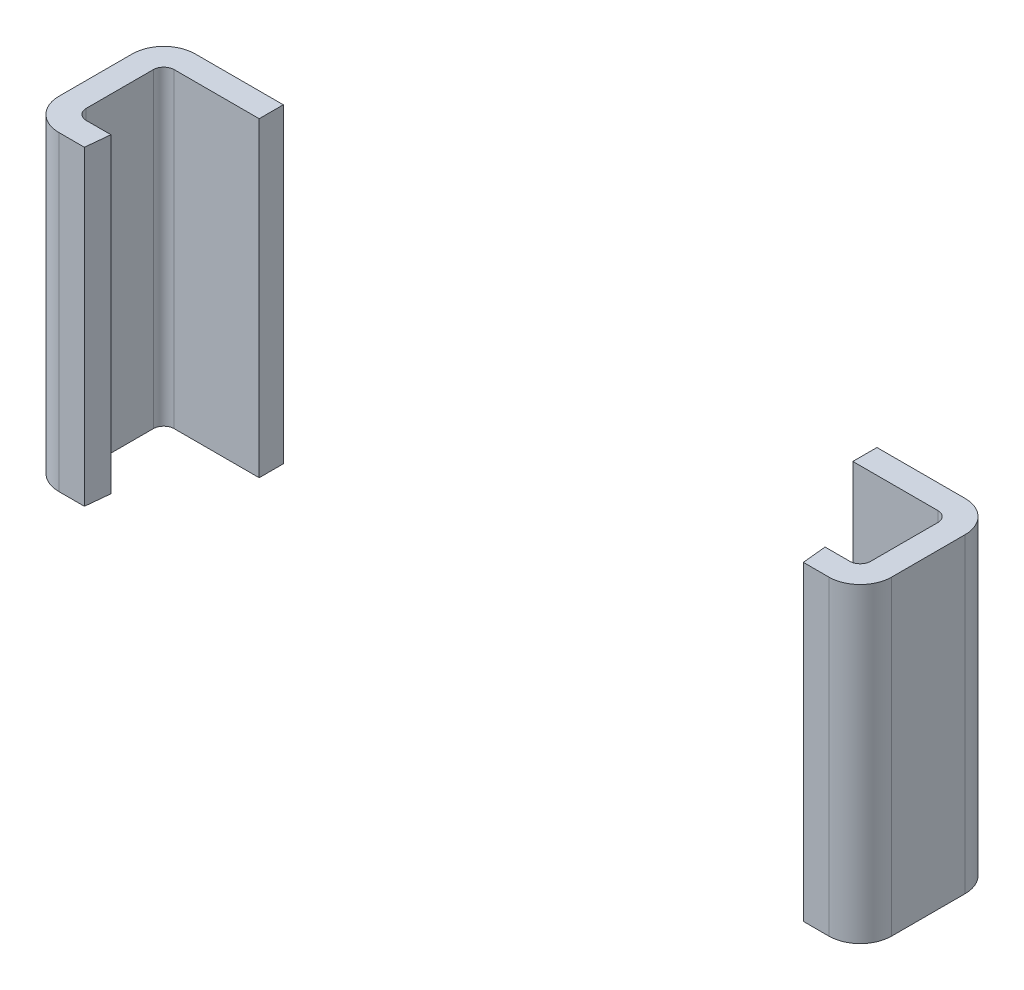
ISO-10303-21;
HEADER;
FILE_DESCRIPTION(('STEP AP214'),'2;1');
FILE_NAME('part.step','',(''),(''),'','','');
FILE_SCHEMA(('AUTOMOTIVE_DESIGN { 1 0 10303 214 1 1 1 1 }'));
ENDSEC;
DATA;
#1=APPLICATION_CONTEXT('core data for automotive mechanical design processes');
#2=APPLICATION_PROTOCOL_DEFINITION('international standard','automotive_design',2000,#1);
#3=PRODUCT_CONTEXT('',#1,'mechanical');
#4=PRODUCT('Part','Part','',(#3));
#5=PRODUCT_RELATED_PRODUCT_CATEGORY('part','',(#4));
#6=PRODUCT_DEFINITION_FORMATION('','',#4);
#7=PRODUCT_DEFINITION_CONTEXT('part definition',#1,'design');
#8=PRODUCT_DEFINITION('design','',#6,#7);
#9=PRODUCT_DEFINITION_SHAPE('','',#8);
#10=(LENGTH_UNIT() NAMED_UNIT(*) SI_UNIT(.MILLI.,.METRE.));
#11=(NAMED_UNIT(*) PLANE_ANGLE_UNIT() SI_UNIT($,.RADIAN.));
#12=(NAMED_UNIT(*) SI_UNIT($,.STERADIAN.) SOLID_ANGLE_UNIT());
#13=UNCERTAINTY_MEASURE_WITH_UNIT(LENGTH_MEASURE(1.E-05),#10,'distance_accuracy_value','');
#14=(GEOMETRIC_REPRESENTATION_CONTEXT(3) GLOBAL_UNCERTAINTY_ASSIGNED_CONTEXT((#13)) GLOBAL_UNIT_ASSIGNED_CONTEXT((#10,
#11,#12)) REPRESENTATION_CONTEXT('',''));
#15=CARTESIAN_POINT('',(0.,0.,0.));
#16=DIRECTION('',(0.,0.,1.));
#17=DIRECTION('',(1.,0.,0.));
#18=AXIS2_PLACEMENT_3D('',#15,#16,#17);
#19=CARTESIAN_POINT('',(85.260001349604,22.017500273039,1.069108));
#20=DIRECTION('',(0.,0.,1.));
#21=DIRECTION('',(0.,-1.,0.));
#22=AXIS2_PLACEMENT_3D('',#19,#20,#21);
#23=PLANE('',#22);
#24=DIRECTION('',(-8.74227765734797E-08,0.999999999999996,0.));
#25=VECTOR('',#24,1.);
#26=CARTESIAN_POINT('',(85.360001349604,22.017500281781,1.069108));
#27=LINE('',#26,#25);
#28=CARTESIAN_POINT('',(85.36000122,22.0175002817811,1.069108));
#29=VERTEX_POINT('',#28);
#30=CARTESIAN_POINT('',(85.3600010903957,24.982500292077,1.069108));
#31=VERTEX_POINT('',#30);
#32=EDGE_CURVE('P0_E208',#29,#31,#27,.T.);
#33=ORIENTED_EDGE('',*,*,#32,.T.);
#34=DIRECTION('',(1.,0.,0.));
#35=VECTOR('',#34,1.);
#36=CARTESIAN_POINT('',(85.260001349604,24.982500302373,1.069108));
#37=LINE('',#36,#35);
#38=CARTESIAN_POINT('',(85.5955403785096,24.9825003023729,1.06910798289056));
#39=VERTEX_POINT('',#38);
#40=EDGE_CURVE('P0_E85',#39,#31,#37,.F.);
#41=ORIENTED_EDGE('',*,*,#40,.F.);
#42=DIRECTION('',(-8.65572045281956E-08,0.999999999999996,-8.65572045281956E-09));
#43=VECTOR('',#42,1.);
#44=CARTESIAN_POINT('',(85.5955406768436,20.547500305602,1.06910801272396));
#45=LINE('',#44,#43);
#46=CARTESIAN_POINT('',(85.5955405496045,22.0175002941683,1.06910800000004));
#47=VERTEX_POINT('',#46);
#48=EDGE_CURVE('P0_E195',#47,#39,#45,.T.);
#49=ORIENTED_EDGE('',*,*,#48,.F.);
#50=DIRECTION('',(1.,0.,0.));
#51=VECTOR('',#50,1.);
#52=CARTESIAN_POINT('',(85.260001349604,22.017500281781,1.069108));
#53=LINE('',#52,#51);
#54=EDGE_CURVE('P0_E204',#29,#47,#53,.T.);
#55=ORIENTED_EDGE('',*,*,#54,.F.);
#56=EDGE_LOOP('',(#33,#41,#49,#55));
#57=FACE_BOUND('',#56,.T.);
#58=ADVANCED_FACE('P0_F17',(#57),#23,.F.);
#59=CARTESIAN_POINT('',(85.360001349604,22.017500281781,0.969108));
#60=DIRECTION('',(-8.74227765734797E-08,0.999999999999996,0.));
#61=DIRECTION('',(-0.999999999999996,-8.74227765734797E-08,0.));
#62=AXIS2_PLACEMENT_3D('',#59,#60,#61);
#63=CYLINDRICAL_SURFACE('',#62,0.1);
#64=DIRECTION('',(8.74227765734797E-08,-0.999999999999996,0.));
#65=VECTOR('',#64,1.);
#66=CARTESIAN_POINT('',(85.260001349604,22.017500273039,0.969108));
#67=LINE('',#66,#65);
#68=CARTESIAN_POINT('',(85.260001349604,22.017500273039,0.969108));
#69=VERTEX_POINT('',#68);
#70=CARTESIAN_POINT('',(85.2600010903955,24.9825002730389,0.969108000000001));
#71=VERTEX_POINT('',#70);
#72=EDGE_CURVE('P0_E186',#69,#71,#67,.F.);
#73=ORIENTED_EDGE('',*,*,#72,.T.);
#74=CARTESIAN_POINT('',(85.3600010903955,24.982500281781,0.969108000000001));
#75=DIRECTION('',(-8.74227765734797E-08,0.999999999999996,0.));
#76=DIRECTION('',(-0.999999999999996,-8.74227765734797E-08,0.));
#77=AXIS2_PLACEMENT_3D('',#74,#75,#76);
#78=CIRCLE('',#77,0.1);
#79=EDGE_CURVE('P0_E20',#31,#71,#78,.F.);
#80=ORIENTED_EDGE('',*,*,#79,.F.);
#81=ORIENTED_EDGE('',*,*,#32,.F.);
#82=CARTESIAN_POINT('',(85.360001349604,22.0175002817813,0.969108));
#83=DIRECTION('',(-8.74227765734797E-08,0.999999999999996,0.));
#84=DIRECTION('',(-0.999999999999996,-8.74227765734797E-08,0.));
#85=AXIS2_PLACEMENT_3D('',#82,#83,#84);
#86=CIRCLE('',#85,0.1);
#87=EDGE_CURVE('P0_E133',#69,#29,#86,.T.);
#88=ORIENTED_EDGE('',*,*,#87,.F.);
#89=EDGE_LOOP('',(#73,#80,#81,#88));
#90=FACE_BOUND('',#89,.T.);
#91=ADVANCED_FACE('P0_F177',(#90),#63,.F.);
#92=CARTESIAN_POINT('',(85.632476478116,20.547500305602,0.69975));
#93=DIRECTION('',(0.995037190209985,8.69889139620287E-08,0.0995037190209985));
#94=DIRECTION('',(0.0995037190209989,0.,-0.995037190209989));
#95=AXIS2_PLACEMENT_3D('',#92,#93,#94);
#96=PLANE('',#95);
#97=ORIENTED_EDGE('',*,*,#48,.T.);
#98=DIRECTION('',(0.0995037190209989,0.,-0.995037190209989));
#99=VECTOR('',#98,1.);
#100=CARTESIAN_POINT('',(85.6324760942348,24.982500302373,0.69974996161188));
#101=LINE('',#100,#99);
#102=CARTESIAN_POINT('',(85.572540290396,24.9825002868963,1.299108));
#103=VERTEX_POINT('',#102);
#104=EDGE_CURVE('P0_E191',#39,#103,#101,.F.);
#105=ORIENTED_EDGE('',*,*,#104,.T.);
#106=DIRECTION('',(0.,1.,0.));
#107=VECTOR('',#106,1.);
#108=CARTESIAN_POINT('',(85.572540290396,22.017500320488,1.299108));
#109=LINE('',#108,#107);
#110=CARTESIAN_POINT('',(85.5725403759434,22.017500300362,1.29910800855474));
#111=VERTEX_POINT('',#110);
#112=EDGE_CURVE('P0_E234',#103,#111,#109,.F.);
#113=ORIENTED_EDGE('',*,*,#112,.T.);
#114=DIRECTION('',(0.0995037190209989,0.,-0.995037190209989));
#115=VECTOR('',#114,1.);
#116=CARTESIAN_POINT('',(85.6324763508769,22.017500300362,0.699749987276091));
#117=LINE('',#116,#115);
#118=EDGE_CURVE('P0_E93',#111,#47,#117,.T.);
#119=ORIENTED_EDGE('',*,*,#118,.T.);
#120=EDGE_LOOP('',(#97,#105,#113,#119));
#121=FACE_BOUND('',#120,.T.);
#122=ADVANCED_FACE('P0_F174',(#121),#96,.T.);
#123=CARTESIAN_POINT('',(85.260001349604,22.017500273039,0.23));
#124=DIRECTION('',(-0.999999999999996,-8.74227765734797E-08,0.));
#125=DIRECTION('',(8.74227765734797E-08,-0.999999999999996,0.));
#126=AXIS2_PLACEMENT_3D('',#123,#124,#125);
#127=PLANE('',#126);
#128=DIRECTION('',(-8.74227765734797E-08,0.999999999999996,0.));
#129=VECTOR('',#128,1.);
#130=CARTESIAN_POINT('',(85.260001349604,22.0175002730387,0.33));
#131=LINE('',#130,#129);
#132=CARTESIAN_POINT('',(85.260001349604,22.0175002730389,0.33));
#133=VERTEX_POINT('',#132);
#134=CARTESIAN_POINT('',(85.2600010903955,24.982500273039,0.330000000000001));
#135=VERTEX_POINT('',#134);
#136=EDGE_CURVE('P0_E227',#133,#135,#131,.T.);
#137=ORIENTED_EDGE('',*,*,#136,.T.);
#138=DIRECTION('',(0.,0.,1.));
#139=VECTOR('',#138,1.);
#140=CARTESIAN_POINT('',(85.2600010903955,24.982500273039,0.23));
#141=LINE('',#140,#139);
#142=EDGE_CURVE('P0_E190',#71,#135,#141,.F.);
#143=ORIENTED_EDGE('',*,*,#142,.F.);
#144=ORIENTED_EDGE('',*,*,#72,.F.);
#145=DIRECTION('',(0.,0.,1.));
#146=VECTOR('',#145,1.);
#147=CARTESIAN_POINT('',(85.260001349604,22.017500273039,0.23));
#148=LINE('',#147,#146);
#149=EDGE_CURVE('P0_E193',#133,#69,#148,.T.);
#150=ORIENTED_EDGE('',*,*,#149,.F.);
#151=EDGE_LOOP('',(#137,#143,#144,#150));
#152=FACE_BOUND('',#151,.T.);
#153=ADVANCED_FACE('P0_F170',(#152),#127,.F.);
#154=CARTESIAN_POINT('',(85.802762349604,22.017500320488,1.299108));
#155=DIRECTION('',(0.,0.,-1.));
#156=DIRECTION('',(0.,1.,0.));
#157=AXIS2_PLACEMENT_3D('',#154,#155,#156);
#158=PLANE('',#157);
#159=ORIENTED_EDGE('',*,*,#112,.F.);
#160=DIRECTION('',(1.,0.,0.));
#161=VECTOR('',#160,1.);
#162=CARTESIAN_POINT('',(85.802762349604,24.982500279158,1.299108));
#163=LINE('',#162,#161);
#164=CARTESIAN_POINT('',(85.3300012199997,24.982500279158,1.299108));
#165=VERTEX_POINT('',#164);
#166=EDGE_CURVE('P0_E240',#165,#103,#163,.T.);
#167=ORIENTED_EDGE('',*,*,#166,.F.);
#168=DIRECTION('',(-8.74227765734797E-08,0.999999999999996,0.));
#169=VECTOR('',#168,1.);
#170=CARTESIAN_POINT('',(85.330001349604,22.017500279158,1.299108));
#171=LINE('',#170,#169);
#172=CARTESIAN_POINT('',(85.330001349604,22.0175002897604,1.299108));
#173=VERTEX_POINT('',#172);
#174=EDGE_CURVE('P0_E222',#173,#165,#171,.T.);
#175=ORIENTED_EDGE('',*,*,#174,.F.);
#176=DIRECTION('',(1.,0.,0.));
#177=VECTOR('',#176,1.);
#178=CARTESIAN_POINT('',(85.802762349604,22.017500300362,1.299108));
#179=LINE('',#178,#177);
#180=EDGE_CURVE('P0_E232',#111,#173,#179,.F.);
#181=ORIENTED_EDGE('',*,*,#180,.F.);
#182=EDGE_LOOP('',(#159,#167,#175,#181));
#183=FACE_BOUND('',#182,.T.);
#184=ADVANCED_FACE('P0_F166',(#183),#158,.F.);
#185=CARTESIAN_POINT('',(85.360001349604,22.017500281781,0.33));
#186=DIRECTION('',(-8.74227765734797E-08,0.999999999999996,0.));
#187=DIRECTION('',(-0.999999999999996,-8.74227765734797E-08,0.));
#188=AXIS2_PLACEMENT_3D('',#185,#186,#187);
#189=CYLINDRICAL_SURFACE('',#188,0.1);
#190=DIRECTION('',(0.,1.,0.));
#191=VECTOR('',#190,1.);
#192=CARTESIAN_POINT('',(85.360001349604,22.017500352594,0.23));
#193=LINE('',#192,#191);
#194=CARTESIAN_POINT('',(85.3600013496043,22.0175003171875,0.23));
#195=VERTEX_POINT('',#194);
#196=CARTESIAN_POINT('',(85.3600012199997,24.9825002817811,0.230000000000001));
#197=VERTEX_POINT('',#196);
#198=EDGE_CURVE('P0_E219',#195,#197,#193,.T.);
#199=ORIENTED_EDGE('',*,*,#198,.T.);
#200=CARTESIAN_POINT('',(85.3600010903955,24.9825002817813,0.330000000000001));
#201=DIRECTION('',(-8.74227765734797E-08,0.999999999999996,0.));
#202=DIRECTION('',(-0.999999999999996,-8.74227765734797E-08,0.));
#203=AXIS2_PLACEMENT_3D('',#200,#201,#202);
#204=CIRCLE('',#203,0.1);
#205=EDGE_CURVE('P0_E226',#135,#197,#204,.F.);
#206=ORIENTED_EDGE('',*,*,#205,.F.);
#207=ORIENTED_EDGE('',*,*,#136,.F.);
#208=CARTESIAN_POINT('',(85.360001349604,22.017500281781,0.33));
#209=DIRECTION('',(-8.74227765734797E-08,0.999999999999996,0.));
#210=DIRECTION('',(-0.999999999999996,-8.74227765734797E-08,0.));
#211=AXIS2_PLACEMENT_3D('',#208,#209,#210);
#212=CIRCLE('',#211,0.1);
#213=EDGE_CURVE('P0_E223',#195,#133,#212,.T.);
#214=ORIENTED_EDGE('',*,*,#213,.F.);
#215=EDGE_LOOP('',(#199,#206,#207,#214));
#216=FACE_BOUND('',#215,.T.);
#217=ADVANCED_FACE('P0_F162',(#216),#189,.F.);
#218=CARTESIAN_POINT('',(85.330001349604,22.017500279158,0.999108));
#219=DIRECTION('',(-8.74227765734797E-08,0.999999999999996,0.));
#220=DIRECTION('',(-0.999999999999996,-8.74227765734797E-08,0.));
#221=AXIS2_PLACEMENT_3D('',#218,#219,#220);
#222=CYLINDRICAL_SURFACE('',#221,0.3);
#223=DIRECTION('',(-8.74227765734797E-08,0.999999999999996,0.));
#224=VECTOR('',#223,1.);
#225=CARTESIAN_POINT('',(85.030001349604,22.017500252932,0.999108));
#226=LINE('',#225,#224);
#227=CARTESIAN_POINT('',(85.0300010903957,24.9825002529312,0.999108000000001));
#228=VERTEX_POINT('',#227);
#229=CARTESIAN_POINT('',(85.030001349604,22.017500252932,0.999108));
#230=VERTEX_POINT('',#229);
#231=EDGE_CURVE('P0_E264',#228,#230,#226,.F.);
#232=ORIENTED_EDGE('',*,*,#231,.T.);
#233=CARTESIAN_POINT('',(85.330001349604,22.0175002791588,0.999108));
#234=DIRECTION('',(-8.74227765734797E-08,0.999999999999996,0.));
#235=DIRECTION('',(-0.999999999999996,-8.74227765734797E-08,0.));
#236=AXIS2_PLACEMENT_3D('',#233,#234,#235);
#237=CIRCLE('',#236,0.3);
#238=EDGE_CURVE('P0_E216',#230,#173,#237,.T.);
#239=ORIENTED_EDGE('',*,*,#238,.T.);
#240=ORIENTED_EDGE('',*,*,#174,.T.);
#241=CARTESIAN_POINT('',(85.3300010903955,24.982500279158,0.999108000000001));
#242=DIRECTION('',(-8.74227765734797E-08,0.999999999999996,0.));
#243=DIRECTION('',(-0.999999999999996,-8.74227765734797E-08,0.));
#244=AXIS2_PLACEMENT_3D('',#241,#242,#243);
#245=CIRCLE('',#244,0.3);
#246=EDGE_CURVE('P0_E220',#165,#228,#245,.F.);
#247=ORIENTED_EDGE('',*,*,#246,.T.);
#248=EDGE_LOOP('',(#232,#239,#240,#247));
#249=FACE_BOUND('',#248,.T.);
#250=ADVANCED_FACE('P0_F158',(#249),#222,.T.);
#251=CARTESIAN_POINT('',(86.170001349604,22.017500352594,0.23));
#252=DIRECTION('',(0.,0.,-1.));
#253=DIRECTION('',(0.,1.,0.));
#254=AXIS2_PLACEMENT_3D('',#251,#252,#253);
#255=PLANE('',#254);
#256=DIRECTION('',(8.74227765734797E-08,-0.999999999999996,0.));
#257=VECTOR('',#256,1.);
#258=CARTESIAN_POINT('',(86.170001349604,22.017500352594,0.23));
#259=LINE('',#258,#257);
#260=CARTESIAN_POINT('',(86.1700012632013,22.0175003525934,0.23));
#261=VERTEX_POINT('',#260);
#262=CARTESIAN_POINT('',(86.1700010903958,24.9825003289894,0.23));
#263=VERTEX_POINT('',#262);
#264=EDGE_CURVE('P0_E127',#261,#263,#259,.F.);
#265=ORIENTED_EDGE('',*,*,#264,.T.);
#266=DIRECTION('',(1.,0.,0.));
#267=VECTOR('',#266,1.);
#268=CARTESIAN_POINT('',(86.170001349604,24.982500281781,0.230000000000001));
#269=LINE('',#268,#267);
#270=EDGE_CURVE('P0_E256',#197,#263,#269,.T.);
#271=ORIENTED_EDGE('',*,*,#270,.F.);
#272=ORIENTED_EDGE('',*,*,#198,.F.);
#273=DIRECTION('',(1.,0.,0.));
#274=VECTOR('',#273,1.);
#275=CARTESIAN_POINT('',(86.170001349604,22.017500352594,0.23));
#276=LINE('',#275,#274);
#277=EDGE_CURVE('P0_E260',#261,#195,#276,.F.);
#278=ORIENTED_EDGE('',*,*,#277,.F.);
#279=EDGE_LOOP('',(#265,#271,#272,#278));
#280=FACE_BOUND('',#279,.T.);
#281=ADVANCED_FACE('P0_F154',(#280),#255,.F.);
#282=CARTESIAN_POINT('',(85.030001349604,22.017500252932,1.299108));
#283=DIRECTION('',(0.999999999999996,8.74227765734797E-08,0.));
#284=DIRECTION('',(-8.74227765734797E-08,0.999999999999996,0.));
#285=AXIS2_PLACEMENT_3D('',#282,#283,#284);
#286=PLANE('',#285);
#287=ORIENTED_EDGE('',*,*,#231,.F.);
#288=DIRECTION('',(0.,0.,1.));
#289=VECTOR('',#288,1.);
#290=CARTESIAN_POINT('',(85.030001090396,24.9825002529311,1.299108));
#291=LINE('',#290,#289);
#292=CARTESIAN_POINT('',(85.0300010903956,24.9825002529315,0.300000000000001));
#293=VERTEX_POINT('',#292);
#294=EDGE_CURVE('P0_E274',#228,#293,#291,.F.);
#295=ORIENTED_EDGE('',*,*,#294,.T.);
#296=DIRECTION('',(-8.74227765734797E-08,0.999999999999996,0.));
#297=VECTOR('',#296,1.);
#298=CARTESIAN_POINT('',(85.030001349604,22.0175002529312,0.3));
#299=LINE('',#298,#297);
#300=CARTESIAN_POINT('',(85.030001349604,22.0175002529316,0.3));
#301=VERTEX_POINT('',#300);
#302=EDGE_CURVE('P0_E215',#301,#293,#299,.T.);
#303=ORIENTED_EDGE('',*,*,#302,.F.);
#304=DIRECTION('',(0.,0.,1.));
#305=VECTOR('',#304,1.);
#306=CARTESIAN_POINT('',(85.030001349604,22.017500252932,1.299108));
#307=LINE('',#306,#305);
#308=EDGE_CURVE('P0_E267',#230,#301,#307,.F.);
#309=ORIENTED_EDGE('',*,*,#308,.F.);
#310=EDGE_LOOP('',(#287,#295,#303,#309));
#311=FACE_BOUND('',#310,.T.);
#312=ADVANCED_FACE('P0_F151',(#311),#286,.F.);
#313=CARTESIAN_POINT('',(86.170001349604,22.017500352594,0.));
#314=DIRECTION('',(-0.999999999999996,-8.74227765734797E-08,0.));
#315=DIRECTION('',(8.74227765734797E-08,-0.999999999999996,0.));
#316=AXIS2_PLACEMENT_3D('',#313,#314,#315);
#317=PLANE('',#316);
#318=DIRECTION('',(0.,0.,1.));
#319=VECTOR('',#318,1.);
#320=CARTESIAN_POINT('',(86.170001090396,24.9825003525931,1.299108));
#321=LINE('',#320,#319);
#322=CARTESIAN_POINT('',(86.1700012632013,24.9825003525937,0.));
#323=VERTEX_POINT('',#322);
#324=EDGE_CURVE('P0_E270',#323,#263,#321,.T.);
#325=ORIENTED_EDGE('',*,*,#324,.T.);
#326=ORIENTED_EDGE('',*,*,#264,.F.);
#327=DIRECTION('',(0.,0.,1.));
#328=VECTOR('',#327,1.);
#329=CARTESIAN_POINT('',(86.170001349604,22.0175003525931,1.299108));
#330=LINE('',#329,#328);
#331=CARTESIAN_POINT('',(86.170001349604,22.0175003036363,0.));
#332=VERTEX_POINT('',#331);
#333=EDGE_CURVE('P0_E121',#332,#261,#330,.T.);
#334=ORIENTED_EDGE('',*,*,#333,.F.);
#335=DIRECTION('',(0.,-1.,0.));
#336=VECTOR('',#335,1.);
#337=CARTESIAN_POINT('',(86.170001349604,22.017500252932,0.));
#338=LINE('',#337,#336);
#339=EDGE_CURVE('P0_E112',#332,#323,#338,.F.);
#340=ORIENTED_EDGE('',*,*,#339,.T.);
#341=EDGE_LOOP('',(#325,#326,#334,#340));
#342=FACE_BOUND('',#341,.T.);
#343=ADVANCED_FACE('P0_F125',(#342),#317,.F.);
#344=CARTESIAN_POINT('',(85.802762090396,24.982500320488,1.299108));
#345=DIRECTION('',(8.74227765734797E-08,-0.999999999999996,0.));
#346=DIRECTION('',(0.999999999999996,8.74227765734797E-08,0.));
#347=AXIS2_PLACEMENT_3D('',#344,#345,#346);
#348=PLANE('',#347);
#349=ORIENTED_EDGE('',*,*,#79,.T.);
#350=ORIENTED_EDGE('',*,*,#142,.T.);
#351=ORIENTED_EDGE('',*,*,#205,.T.);
#352=ORIENTED_EDGE('',*,*,#270,.T.);
#353=ORIENTED_EDGE('',*,*,#324,.F.);
#354=DIRECTION('',(1.,0.,0.));
#355=VECTOR('',#354,1.);
#356=CARTESIAN_POINT('',(85.030001349604,24.982500352594,0.));
#357=LINE('',#356,#355);
#358=CARTESIAN_POINT('',(85.3300010903957,24.9825003158764,0.));
#359=VERTEX_POINT('',#358);
#360=EDGE_CURVE('P0_E118',#323,#359,#357,.F.);
#361=ORIENTED_EDGE('',*,*,#360,.T.);
#362=CARTESIAN_POINT('',(85.3300010903955,24.9825002791588,0.300000000000001));
#363=DIRECTION('',(-8.74227765734797E-08,0.999999999999996,0.));
#364=DIRECTION('',(-0.999999999999996,-8.74227765734797E-08,0.));
#365=AXIS2_PLACEMENT_3D('',#362,#363,#364);
#366=CIRCLE('',#365,0.3);
#367=EDGE_CURVE('P0_E213',#293,#359,#366,.F.);
#368=ORIENTED_EDGE('',*,*,#367,.F.);
#369=ORIENTED_EDGE('',*,*,#294,.F.);
#370=ORIENTED_EDGE('',*,*,#246,.F.);
#371=ORIENTED_EDGE('',*,*,#166,.T.);
#372=ORIENTED_EDGE('',*,*,#104,.F.);
#373=ORIENTED_EDGE('',*,*,#40,.T.);
#374=EDGE_LOOP('',(#349,#350,#351,#352,#353,#361,#368,#369,#370,#371,#372,#373));
#375=FACE_BOUND('',#374,.T.);
#376=ADVANCED_FACE('P0_F143',(#375),#348,.F.);
#377=CARTESIAN_POINT('',(85.330001349604,22.017500279158,0.3));
#378=DIRECTION('',(-8.74227765734797E-08,0.999999999999996,0.));
#379=DIRECTION('',(-0.999999999999996,-8.74227765734797E-08,0.));
#380=AXIS2_PLACEMENT_3D('',#377,#378,#379);
#381=CYLINDRICAL_SURFACE('',#380,0.3);
#382=DIRECTION('',(0.,-1.,0.));
#383=VECTOR('',#382,1.);
#384=CARTESIAN_POINT('',(85.330001090396,22.017500252932,0.));
#385=LINE('',#384,#383);
#386=CARTESIAN_POINT('',(85.3300012200003,22.017500279158,0.));
#387=VERTEX_POINT('',#386);
#388=EDGE_CURVE('P0_E26',#359,#387,#385,.T.);
#389=ORIENTED_EDGE('',*,*,#388,.T.);
#390=CARTESIAN_POINT('',(85.330001349604,22.017500279158,0.3));
#391=DIRECTION('',(-8.74227765734797E-08,0.999999999999996,0.));
#392=DIRECTION('',(-0.999999999999996,-8.74227765734797E-08,0.));
#393=AXIS2_PLACEMENT_3D('',#390,#391,#392);
#394=CIRCLE('',#393,0.3);
#395=EDGE_CURVE('P0_E34',#301,#387,#394,.F.);
#396=ORIENTED_EDGE('',*,*,#395,.F.);
#397=ORIENTED_EDGE('',*,*,#302,.T.);
#398=ORIENTED_EDGE('',*,*,#367,.T.);
#399=EDGE_LOOP('',(#389,#396,#397,#398));
#400=FACE_BOUND('',#399,.T.);
#401=ADVANCED_FACE('P0_F135',(#400),#381,.T.);
#402=CARTESIAN_POINT('',(85.802762349604,22.017500320488,1.299108));
#403=DIRECTION('',(8.74227765734797E-08,-0.999999999999996,0.));
#404=DIRECTION('',(0.999999999999996,8.74227765734797E-08,0.));
#405=AXIS2_PLACEMENT_3D('',#402,#403,#404);
#406=PLANE('',#405);
#407=ORIENTED_EDGE('',*,*,#87,.T.);
#408=ORIENTED_EDGE('',*,*,#54,.T.);
#409=ORIENTED_EDGE('',*,*,#118,.F.);
#410=ORIENTED_EDGE('',*,*,#180,.T.);
#411=ORIENTED_EDGE('',*,*,#238,.F.);
#412=ORIENTED_EDGE('',*,*,#308,.T.);
#413=ORIENTED_EDGE('',*,*,#395,.T.);
#414=DIRECTION('',(1.,0.,0.));
#415=VECTOR('',#414,1.);
#416=CARTESIAN_POINT('',(85.030001349604,22.017500279158,0.));
#417=LINE('',#416,#415);
#418=EDGE_CURVE('P0_E11',#387,#332,#417,.T.);
#419=ORIENTED_EDGE('',*,*,#418,.T.);
#420=ORIENTED_EDGE('',*,*,#333,.T.);
#421=ORIENTED_EDGE('',*,*,#277,.T.);
#422=ORIENTED_EDGE('',*,*,#213,.T.);
#423=ORIENTED_EDGE('',*,*,#149,.T.);
#424=EDGE_LOOP('',(#407,#408,#409,#410,#411,#412,#413,#419,#420,#421,#422,#423));
#425=FACE_BOUND('',#424,.T.);
#426=ADVANCED_FACE('P0_F131',(#425),#406,.T.);
#427=CARTESIAN_POINT('',(85.030001349604,22.017500252932,0.));
#428=DIRECTION('',(0.,0.,1.));
#429=DIRECTION('',(0.,-1.,0.));
#430=AXIS2_PLACEMENT_3D('',#427,#428,#429);
#431=PLANE('',#430);
#432=ORIENTED_EDGE('',*,*,#388,.F.);
#433=ORIENTED_EDGE('',*,*,#360,.F.);
#434=ORIENTED_EDGE('',*,*,#339,.F.);
#435=ORIENTED_EDGE('',*,*,#418,.F.);
#436=EDGE_LOOP('',(#432,#433,#434,#435));
#437=FACE_BOUND('',#436,.T.);
#438=ADVANCED_FACE('P0_F115',(#437),#431,.F.);
#439=CLOSED_SHELL('',(#58,#91,#122,#153,#184,#217,#250,#281,#312,#343,#376,#401,#426,#438));
#440=MANIFOLD_SOLID_BREP('P0_B1',#439);
#441=CARTESIAN_POINT('',(92.740001349604,22.017500926961,1.069108));
#442=DIRECTION('',(0.,0.,1.));
#443=DIRECTION('',(0.,-1.,0.));
#444=AXIS2_PLACEMENT_3D('',#441,#442,#443);
#445=PLANE('',#444);
#446=DIRECTION('',(1.,0.,0.));
#447=VECTOR('',#446,1.);
#448=CARTESIAN_POINT('',(92.740001349604,24.982500918219,1.069108));
#449=LINE('',#448,#447);
#450=CARTESIAN_POINT('',(92.640001155198,24.9825009182189,1.069108));
#451=VERTEX_POINT('',#450);
#452=CARTESIAN_POINT('',(92.4044618903957,24.9825009058317,1.06910800000004));
#453=VERTEX_POINT('',#452);
#454=EDGE_CURVE('P1_E121',#451,#453,#449,.F.);
#455=ORIENTED_EDGE('',*,*,#454,.F.);
#456=DIRECTION('',(-8.74227765734797E-08,0.999999999999996,0.));
#457=VECTOR('',#456,1.);
#458=CARTESIAN_POINT('',(92.6400013496045,22.017500918219,1.069108));
#459=LINE('',#458,#457);
#460=CARTESIAN_POINT('',(92.6400013496043,22.017500907923,1.069108));
#461=VERTEX_POINT('',#460);
#462=EDGE_CURVE('P1_E106',#451,#461,#459,.F.);
#463=ORIENTED_EDGE('',*,*,#462,.T.);
#464=DIRECTION('',(1.,0.,0.));
#465=VECTOR('',#464,1.);
#466=CARTESIAN_POINT('',(92.740001349604,22.017500897627,1.069108));
#467=LINE('',#466,#465);
#468=CARTESIAN_POINT('',(92.4044620614904,22.0175008976271,1.06910798289056));
#469=VERTEX_POINT('',#468);
#470=EDGE_CURVE('P1_E115',#469,#461,#467,.T.);
#471=ORIENTED_EDGE('',*,*,#470,.F.);
#472=DIRECTION('',(-8.65572045281956E-08,0.999999999999996,8.65572045281956E-09));
#473=VECTOR('',#472,1.);
#474=CARTESIAN_POINT('',(92.4044617631564,26.452500894398,1.06910801272396));
#475=LINE('',#474,#473);
#476=EDGE_CURVE('P1_E138',#453,#469,#475,.F.);
#477=ORIENTED_EDGE('',*,*,#476,.F.);
#478=EDGE_LOOP('',(#455,#463,#471,#477));
#479=FACE_BOUND('',#478,.T.);
#480=ADVANCED_FACE('P1_F17',(#479),#445,.F.);
#481=CARTESIAN_POINT('',(92.367525961884,26.452500894398,0.69975));
#482=DIRECTION('',(-0.995037190209985,-8.69889139620287E-08,0.0995037190209985));
#483=DIRECTION('',(0.0995037190209989,0.,0.995037190209989));
#484=AXIS2_PLACEMENT_3D('',#481,#482,#483);
#485=PLANE('',#484);
#486=ORIENTED_EDGE('',*,*,#476,.T.);
#487=DIRECTION('',(0.0995037190209989,0.,0.995037190209989));
#488=VECTOR('',#487,1.);
#489=CARTESIAN_POINT('',(92.3675263457652,22.017500897627,0.69974996161188));
#490=LINE('',#489,#488);
#491=CARTESIAN_POINT('',(92.427462149604,22.0175009131037,1.299108));
#492=VERTEX_POINT('',#491);
#493=EDGE_CURVE('P1_E113',#469,#492,#490,.T.);
#494=ORIENTED_EDGE('',*,*,#493,.T.);
#495=DIRECTION('',(0.,1.,0.));
#496=VECTOR('',#495,1.);
#497=CARTESIAN_POINT('',(92.427462149604,22.017500879512,1.299108));
#498=LINE('',#497,#496);
#499=CARTESIAN_POINT('',(92.4274620640566,24.982500899638,1.29910800855474));
#500=VERTEX_POINT('',#499);
#501=EDGE_CURVE('P1_E126',#492,#500,#498,.T.);
#502=ORIENTED_EDGE('',*,*,#501,.T.);
#503=DIRECTION('',(0.0995037190209989,0.,0.995037190209989));
#504=VECTOR('',#503,1.);
#505=CARTESIAN_POINT('',(92.3675260891231,24.982500899638,0.699749987276091));
#506=LINE('',#505,#504);
#507=EDGE_CURVE('P1_E133',#500,#453,#506,.F.);
#508=ORIENTED_EDGE('',*,*,#507,.T.);
#509=EDGE_LOOP('',(#486,#494,#502,#508));
#510=FACE_BOUND('',#509,.T.);
#511=ADVANCED_FACE('P1_F182',(#510),#485,.T.);
#512=CARTESIAN_POINT('',(92.640001349604,22.017500918219,0.969108));
#513=DIRECTION('',(-8.74227765734797E-08,0.999999999999996,0.));
#514=DIRECTION('',(-0.999999999999996,-8.74227765734797E-08,0.));
#515=AXIS2_PLACEMENT_3D('',#512,#513,#514);
#516=CYLINDRICAL_SURFACE('',#515,0.1);
#517=CARTESIAN_POINT('',(92.6400010903955,24.9825009182187,0.969108000000001));
#518=DIRECTION('',(-8.74227765734797E-08,0.999999999999996,0.));
#519=DIRECTION('',(-0.999999999999996,-8.74227765734797E-08,0.));
#520=AXIS2_PLACEMENT_3D('',#517,#518,#519);
#521=CIRCLE('',#520,0.1);
#522=CARTESIAN_POINT('',(92.7400010903955,24.982500926961,0.969108000000001));
#523=VERTEX_POINT('',#522);
#524=EDGE_CURVE('P1_E112',#523,#451,#521,.F.);
#525=ORIENTED_EDGE('',*,*,#524,.F.);
#526=DIRECTION('',(-8.74227765734797E-08,0.999999999999996,0.));
#527=VECTOR('',#526,1.);
#528=CARTESIAN_POINT('',(92.740001349604,22.017500926961,0.969108));
#529=LINE('',#528,#527);
#530=CARTESIAN_POINT('',(92.740001349604,22.0175009269611,0.969108));
#531=VERTEX_POINT('',#530);
#532=EDGE_CURVE('P1_E109',#523,#531,#529,.F.);
#533=ORIENTED_EDGE('',*,*,#532,.T.);
#534=CARTESIAN_POINT('',(92.640001349604,22.017500918219,0.969108));
#535=DIRECTION('',(-8.74227765734797E-08,0.999999999999996,0.));
#536=DIRECTION('',(-0.999999999999996,-8.74227765734797E-08,0.));
#537=AXIS2_PLACEMENT_3D('',#534,#535,#536);
#538=CIRCLE('',#537,0.1);
#539=EDGE_CURVE('P1_E20',#461,#531,#538,.T.);
#540=ORIENTED_EDGE('',*,*,#539,.F.);
#541=ORIENTED_EDGE('',*,*,#462,.F.);
#542=EDGE_LOOP('',(#525,#533,#540,#541));
#543=FACE_BOUND('',#542,.T.);
#544=ADVANCED_FACE('P1_F104',(#543),#516,.F.);
#545=CARTESIAN_POINT('',(92.197240349604,22.017500879512,1.299108));
#546=DIRECTION('',(0.,0.,-1.));
#547=DIRECTION('',(0.,1.,0.));
#548=AXIS2_PLACEMENT_3D('',#545,#546,#547);
#549=PLANE('',#548);
#550=DIRECTION('',(1.,0.,0.));
#551=VECTOR('',#550,1.);
#552=CARTESIAN_POINT('',(92.197240349604,24.982500899638,1.299108));
#553=LINE('',#552,#551);
#554=CARTESIAN_POINT('',(92.6700010903957,24.9825009102396,1.299108));
#555=VERTEX_POINT('',#554);
#556=EDGE_CURVE('P1_E175',#500,#555,#553,.T.);
#557=ORIENTED_EDGE('',*,*,#556,.F.);
#558=ORIENTED_EDGE('',*,*,#501,.F.);
#559=DIRECTION('',(1.,0.,0.));
#560=VECTOR('',#559,1.);
#561=CARTESIAN_POINT('',(92.197240349604,22.017500920842,1.299108));
#562=LINE('',#561,#560);
#563=CARTESIAN_POINT('',(92.6700012848024,22.017500920842,1.299108));
#564=VERTEX_POINT('',#563);
#565=EDGE_CURVE('P1_E124',#564,#492,#562,.F.);
#566=ORIENTED_EDGE('',*,*,#565,.F.);
#567=DIRECTION('',(-8.74227765734797E-08,0.999999999999996,0.));
#568=VECTOR('',#567,1.);
#569=CARTESIAN_POINT('',(92.6700013496045,22.017500920842,1.299108));
#570=LINE('',#569,#568);
#571=EDGE_CURVE('P1_E156',#555,#564,#570,.F.);
#572=ORIENTED_EDGE('',*,*,#571,.F.);
#573=EDGE_LOOP('',(#557,#558,#566,#572));
#574=FACE_BOUND('',#573,.T.);
#575=ADVANCED_FACE('P1_F185',(#574),#549,.F.);
#576=CARTESIAN_POINT('',(92.740001349604,22.017500926961,0.23));
#577=DIRECTION('',(0.999999999999996,8.74227765734797E-08,0.));
#578=DIRECTION('',(-8.74227765734797E-08,0.999999999999996,0.));
#579=AXIS2_PLACEMENT_3D('',#576,#577,#578);
#580=PLANE('',#579);
#581=DIRECTION('',(0.,0.,1.));
#582=VECTOR('',#581,1.);
#583=CARTESIAN_POINT('',(92.7400010903955,24.982500926961,0.23));
#584=LINE('',#583,#582);
#585=CARTESIAN_POINT('',(92.7400010903955,24.9825009269611,0.330000000000001));
#586=VERTEX_POINT('',#585);
#587=EDGE_CURVE('P1_E165',#586,#523,#584,.T.);
#588=ORIENTED_EDGE('',*,*,#587,.F.);
#589=DIRECTION('',(-8.74227765734797E-08,0.999999999999996,0.));
#590=VECTOR('',#589,1.);
#591=CARTESIAN_POINT('',(92.740001349604,22.0175009269613,0.329999999999999));
#592=LINE('',#591,#590);
#593=CARTESIAN_POINT('',(92.740001349604,22.017500926961,0.329999999999999));
#594=VERTEX_POINT('',#593);
#595=EDGE_CURVE('P1_E153',#586,#594,#592,.F.);
#596=ORIENTED_EDGE('',*,*,#595,.T.);
#597=DIRECTION('',(0.,0.,1.));
#598=VECTOR('',#597,1.);
#599=CARTESIAN_POINT('',(92.740001349604,22.017500926961,0.23));
#600=LINE('',#599,#598);
#601=EDGE_CURVE('P1_E168',#531,#594,#600,.F.);
#602=ORIENTED_EDGE('',*,*,#601,.F.);
#603=ORIENTED_EDGE('',*,*,#532,.F.);
#604=EDGE_LOOP('',(#588,#596,#602,#603));
#605=FACE_BOUND('',#604,.T.);
#606=ADVANCED_FACE('P1_F234',(#605),#580,.F.);
#607=CARTESIAN_POINT('',(92.670001349604,22.017500920842,0.999108));
#608=DIRECTION('',(-8.74227765734797E-08,0.999999999999996,0.));
#609=DIRECTION('',(-0.999999999999996,-8.74227765734797E-08,0.));
#610=AXIS2_PLACEMENT_3D('',#607,#608,#609);
#611=CYLINDRICAL_SURFACE('',#610,0.3);
#612=CARTESIAN_POINT('',(92.6700010903955,24.9825009208412,0.999108000000001));
#613=DIRECTION('',(-8.74227765734797E-08,0.999999999999996,0.));
#614=DIRECTION('',(-0.999999999999996,-8.74227765734797E-08,0.));
#615=AXIS2_PLACEMENT_3D('',#612,#613,#614);
#616=CIRCLE('',#615,0.3);
#617=CARTESIAN_POINT('',(92.9700010903955,24.982500947068,0.999108000000001));
#618=VERTEX_POINT('',#617);
#619=EDGE_CURVE('P1_E157',#618,#555,#616,.F.);
#620=ORIENTED_EDGE('',*,*,#619,.T.);
#621=ORIENTED_EDGE('',*,*,#571,.T.);
#622=CARTESIAN_POINT('',(92.670001349604,22.017500920842,0.999108));
#623=DIRECTION('',(-8.74227765734797E-08,0.999999999999996,0.));
#624=DIRECTION('',(-0.999999999999996,-8.74227765734797E-08,0.));
#625=AXIS2_PLACEMENT_3D('',#622,#623,#624);
#626=CIRCLE('',#625,0.3);
#627=CARTESIAN_POINT('',(92.970001349604,22.0175009470689,0.999108));
#628=VERTEX_POINT('',#627);
#629=EDGE_CURVE('P1_E159',#564,#628,#626,.T.);
#630=ORIENTED_EDGE('',*,*,#629,.T.);
#631=DIRECTION('',(8.74227765734797E-08,-0.999999999999996,0.));
#632=VECTOR('',#631,1.);
#633=CARTESIAN_POINT('',(92.970001349604,22.017500947068,0.999108));
#634=LINE('',#633,#632);
#635=EDGE_CURVE('P1_E220',#628,#618,#634,.F.);
#636=ORIENTED_EDGE('',*,*,#635,.T.);
#637=EDGE_LOOP('',(#620,#621,#630,#636));
#638=FACE_BOUND('',#637,.T.);
#639=ADVANCED_FACE('P1_F228',(#638),#611,.T.);
#640=CARTESIAN_POINT('',(92.640001349604,22.017500918219,0.33));
#641=DIRECTION('',(-8.74227765734797E-08,0.999999999999996,0.));
#642=DIRECTION('',(-0.999999999999996,-8.74227765734797E-08,0.));
#643=AXIS2_PLACEMENT_3D('',#640,#641,#642);
#644=CYLINDRICAL_SURFACE('',#643,0.1);
#645=CARTESIAN_POINT('',(92.6400010903955,24.982500918219,0.330000000000001));
#646=DIRECTION('',(-8.74227765734797E-08,0.999999999999996,0.));
#647=DIRECTION('',(-0.999999999999996,-8.74227765734797E-08,0.));
#648=AXIS2_PLACEMENT_3D('',#645,#646,#647);
#649=CIRCLE('',#648,0.1);
#650=CARTESIAN_POINT('',(92.6400010903957,24.9825009182187,0.23));
#651=VERTEX_POINT('',#650);
#652=EDGE_CURVE('P1_E150',#651,#586,#649,.F.);
#653=ORIENTED_EDGE('',*,*,#652,.F.);
#654=DIRECTION('',(0.,1.,0.));
#655=VECTOR('',#654,1.);
#656=CARTESIAN_POINT('',(92.640001090396,22.017500847406,0.23));
#657=LINE('',#656,#655);
#658=CARTESIAN_POINT('',(92.64000122,22.017500918219,0.23));
#659=VERTEX_POINT('',#658);
#660=EDGE_CURVE('P1_E196',#651,#659,#657,.F.);
#661=ORIENTED_EDGE('',*,*,#660,.T.);
#662=CARTESIAN_POINT('',(92.640001349604,22.0175009182187,0.33));
#663=DIRECTION('',(-8.74227765734797E-08,0.999999999999996,0.));
#664=DIRECTION('',(-0.999999999999996,-8.74227765734797E-08,0.));
#665=AXIS2_PLACEMENT_3D('',#662,#663,#664);
#666=CIRCLE('',#665,0.1);
#667=EDGE_CURVE('P1_E154',#594,#659,#666,.T.);
#668=ORIENTED_EDGE('',*,*,#667,.F.);
#669=ORIENTED_EDGE('',*,*,#595,.F.);
#670=EDGE_LOOP('',(#653,#661,#668,#669));
#671=FACE_BOUND('',#670,.T.);
#672=ADVANCED_FACE('P1_F240',(#671),#644,.F.);
#673=CARTESIAN_POINT('',(92.970001349604,22.017500947068,1.299108));
#674=DIRECTION('',(-0.999999999999996,-8.74227765734797E-08,0.));
#675=DIRECTION('',(8.74227765734797E-08,-0.999999999999996,0.));
#676=AXIS2_PLACEMENT_3D('',#673,#674,#675);
#677=PLANE('',#676);
#678=DIRECTION('',(0.,0.,1.));
#679=VECTOR('',#678,1.);
#680=CARTESIAN_POINT('',(92.9700010903955,24.982500947068,1.299108));
#681=LINE('',#680,#679);
#682=CARTESIAN_POINT('',(92.9700010903955,24.9825009470684,0.300000000000001));
#683=VERTEX_POINT('',#682);
#684=EDGE_CURVE('P1_E218',#618,#683,#681,.F.);
#685=ORIENTED_EDGE('',*,*,#684,.F.);
#686=ORIENTED_EDGE('',*,*,#635,.F.);
#687=DIRECTION('',(0.,0.,1.));
#688=VECTOR('',#687,1.);
#689=CARTESIAN_POINT('',(92.970001349604,22.0175009470689,1.299108));
#690=LINE('',#689,#688);
#691=CARTESIAN_POINT('',(92.970001349604,22.0175009470685,0.299999999999999));
#692=VERTEX_POINT('',#691);
#693=EDGE_CURVE('P1_E149',#692,#628,#690,.T.);
#694=ORIENTED_EDGE('',*,*,#693,.F.);
#695=DIRECTION('',(-8.74227765734797E-08,0.999999999999996,0.));
#696=VECTOR('',#695,1.);
#697=CARTESIAN_POINT('',(92.970001349604,22.0175009470688,0.299999999999999));
#698=LINE('',#697,#696);
#699=EDGE_CURVE('P1_E148',#683,#692,#698,.F.);
#700=ORIENTED_EDGE('',*,*,#699,.F.);
#701=EDGE_LOOP('',(#685,#686,#694,#700));
#702=FACE_BOUND('',#701,.T.);
#703=ADVANCED_FACE('P1_F283',(#702),#677,.F.);
#704=CARTESIAN_POINT('',(91.830001349604,22.017500847406,0.23));
#705=DIRECTION('',(0.,0.,-1.));
#706=DIRECTION('',(0.,1.,0.));
#707=AXIS2_PLACEMENT_3D('',#704,#705,#706);
#708=PLANE('',#707);
#709=DIRECTION('',(0.999999999999996,8.74227765734797E-08,0.));
#710=VECTOR('',#709,1.);
#711=CARTESIAN_POINT('',(92.197240090396,24.982500879511,0.23));
#712=LINE('',#711,#710);
#713=CARTESIAN_POINT('',(91.8300010903956,24.982500847406,0.23));
#714=VERTEX_POINT('',#713);
#715=EDGE_CURVE('P1_E145',#651,#714,#712,.F.);
#716=ORIENTED_EDGE('',*,*,#715,.T.);
#717=DIRECTION('',(-8.74227765734797E-08,0.999999999999996,0.));
#718=VECTOR('',#717,1.);
#719=CARTESIAN_POINT('',(91.830001349604,22.017500847406,0.23));
#720=LINE('',#719,#718);
#721=CARTESIAN_POINT('',(91.830001349604,22.0175008474065,0.23));
#722=VERTEX_POINT('',#721);
#723=EDGE_CURVE('P1_E208',#714,#722,#720,.F.);
#724=ORIENTED_EDGE('',*,*,#723,.T.);
#725=DIRECTION('',(0.999999999999996,8.74227765734797E-08,0.));
#726=VECTOR('',#725,1.);
#727=CARTESIAN_POINT('',(92.197240349604,22.017500879512,0.23));
#728=LINE('',#727,#726);
#729=EDGE_CURVE('P1_E194',#659,#722,#728,.F.);
#730=ORIENTED_EDGE('',*,*,#729,.F.);
#731=ORIENTED_EDGE('',*,*,#660,.F.);
#732=EDGE_LOOP('',(#716,#724,#730,#731));
#733=FACE_BOUND('',#732,.T.);
#734=ADVANCED_FACE('P1_F243',(#733),#708,.F.);
#735=CARTESIAN_POINT('',(92.197240349604,22.017500879512,1.299108));
#736=DIRECTION('',(8.74227765734797E-08,-0.999999999999996,0.));
#737=DIRECTION('',(0.999999999999996,8.74227765734797E-08,0.));
#738=AXIS2_PLACEMENT_3D('',#735,#736,#737);
#739=PLANE('',#738);
#740=ORIENTED_EDGE('',*,*,#565,.T.);
#741=ORIENTED_EDGE('',*,*,#493,.F.);
#742=ORIENTED_EDGE('',*,*,#470,.T.);
#743=ORIENTED_EDGE('',*,*,#539,.T.);
#744=ORIENTED_EDGE('',*,*,#601,.T.);
#745=ORIENTED_EDGE('',*,*,#667,.T.);
#746=ORIENTED_EDGE('',*,*,#729,.T.);
#747=DIRECTION('',(0.,0.,1.));
#748=VECTOR('',#747,1.);
#749=CARTESIAN_POINT('',(91.830001349604,22.017500847406,0.));
#750=LINE('',#749,#748);
#751=CARTESIAN_POINT('',(91.83000122,22.017500847406,0.));
#752=VERTEX_POINT('',#751);
#753=EDGE_CURVE('P1_E204',#722,#752,#750,.F.);
#754=ORIENTED_EDGE('',*,*,#753,.T.);
#755=DIRECTION('',(1.,0.,0.));
#756=VECTOR('',#755,1.);
#757=CARTESIAN_POINT('',(92.970001349604,22.017500847406,0.));
#758=LINE('',#757,#756);
#759=CARTESIAN_POINT('',(92.670001349604,22.0175008841236,0.));
#760=VERTEX_POINT('',#759);
#761=EDGE_CURVE('P1_E207',#752,#760,#758,.T.);
#762=ORIENTED_EDGE('',*,*,#761,.T.);
#763=CARTESIAN_POINT('',(92.670001349604,22.0175009208412,0.3));
#764=DIRECTION('',(-8.74227765734797E-08,0.999999999999996,0.));
#765=DIRECTION('',(-0.999999999999996,-8.74227765734797E-08,0.));
#766=AXIS2_PLACEMENT_3D('',#763,#764,#765);
#767=CIRCLE('',#766,0.3);
#768=EDGE_CURVE('P1_E146',#692,#760,#767,.T.);
#769=ORIENTED_EDGE('',*,*,#768,.F.);
#770=ORIENTED_EDGE('',*,*,#693,.T.);
#771=ORIENTED_EDGE('',*,*,#629,.F.);
#772=EDGE_LOOP('',(#740,#741,#742,#743,#744,#745,#746,#754,#762,#769,#770,#771));
#773=FACE_BOUND('',#772,.T.);
#774=ADVANCED_FACE('P1_F117',(#773),#739,.T.);
#775=CARTESIAN_POINT('',(92.670001349604,22.017500920842,0.3));
#776=DIRECTION('',(-8.74227765734797E-08,0.999999999999996,0.));
#777=DIRECTION('',(-0.999999999999996,-8.74227765734797E-08,0.));
#778=AXIS2_PLACEMENT_3D('',#775,#776,#777);
#779=CYLINDRICAL_SURFACE('',#778,0.3);
#780=CARTESIAN_POINT('',(92.6700010903955,24.982500920842,0.300000000000001));
#781=DIRECTION('',(-8.74227765734797E-08,0.999999999999996,0.));
#782=DIRECTION('',(-0.999999999999996,-8.74227765734797E-08,0.));
#783=AXIS2_PLACEMENT_3D('',#780,#781,#782);
#784=CIRCLE('',#783,0.3);
#785=CARTESIAN_POINT('',(92.6700012199997,24.982500920842,0.));
#786=VERTEX_POINT('',#785);
#787=EDGE_CURVE('P1_E142',#786,#683,#784,.F.);
#788=ORIENTED_EDGE('',*,*,#787,.T.);
#789=ORIENTED_EDGE('',*,*,#699,.T.);
#790=ORIENTED_EDGE('',*,*,#768,.T.);
#791=DIRECTION('',(0.,-1.,0.));
#792=VECTOR('',#791,1.);
#793=CARTESIAN_POINT('',(92.670001349604,22.017500947068,0.));
#794=LINE('',#793,#792);
#795=EDGE_CURVE('P1_E252',#760,#786,#794,.F.);
#796=ORIENTED_EDGE('',*,*,#795,.T.);
#797=EDGE_LOOP('',(#788,#789,#790,#796));
#798=FACE_BOUND('',#797,.T.);
#799=ADVANCED_FACE('P1_F264',(#798),#779,.T.);
#800=CARTESIAN_POINT('',(92.197240090396,24.982500879511,1.299108));
#801=DIRECTION('',(8.74227765734797E-08,-0.999999999999996,0.));
#802=DIRECTION('',(0.999999999999996,8.74227765734797E-08,0.));
#803=AXIS2_PLACEMENT_3D('',#800,#801,#802);
#804=PLANE('',#803);
#805=ORIENTED_EDGE('',*,*,#556,.T.);
#806=ORIENTED_EDGE('',*,*,#619,.F.);
#807=ORIENTED_EDGE('',*,*,#684,.T.);
#808=ORIENTED_EDGE('',*,*,#787,.F.);
#809=DIRECTION('',(1.,0.,0.));
#810=VECTOR('',#809,1.);
#811=CARTESIAN_POINT('',(92.970001349604,24.982500920842,0.));
#812=LINE('',#811,#810);
#813=CARTESIAN_POINT('',(91.8300010903957,24.9825008963633,0.));
#814=VERTEX_POINT('',#813);
#815=EDGE_CURVE('P1_E26',#786,#814,#812,.F.);
#816=ORIENTED_EDGE('',*,*,#815,.T.);
#817=DIRECTION('',(0.,0.,1.));
#818=VECTOR('',#817,1.);
#819=CARTESIAN_POINT('',(91.8300010903955,24.982500847406,0.));
#820=LINE('',#819,#818);
#821=EDGE_CURVE('P1_E34',#814,#714,#820,.T.);
#822=ORIENTED_EDGE('',*,*,#821,.T.);
#823=ORIENTED_EDGE('',*,*,#715,.F.);
#824=ORIENTED_EDGE('',*,*,#652,.T.);
#825=ORIENTED_EDGE('',*,*,#587,.T.);
#826=ORIENTED_EDGE('',*,*,#524,.T.);
#827=ORIENTED_EDGE('',*,*,#454,.T.);
#828=ORIENTED_EDGE('',*,*,#507,.F.);
#829=EDGE_LOOP('',(#805,#806,#807,#808,#816,#822,#823,#824,#825,#826,#827,#828));
#830=FACE_BOUND('',#829,.T.);
#831=ADVANCED_FACE('P1_F231',(#830),#804,.F.);
#832=CARTESIAN_POINT('',(91.830001349604,22.017500847406,0.));
#833=DIRECTION('',(0.999999999999996,8.74227765734797E-08,0.));
#834=DIRECTION('',(-8.74227765734797E-08,0.999999999999996,0.));
#835=AXIS2_PLACEMENT_3D('',#832,#833,#834);
#836=PLANE('',#835);
#837=ORIENTED_EDGE('',*,*,#723,.F.);
#838=ORIENTED_EDGE('',*,*,#821,.F.);
#839=DIRECTION('',(0.,-1.,0.));
#840=VECTOR('',#839,1.);
#841=CARTESIAN_POINT('',(91.830001090396,22.017500947068,0.));
#842=LINE('',#841,#840);
#843=EDGE_CURVE('P1_E11',#814,#752,#842,.T.);
#844=ORIENTED_EDGE('',*,*,#843,.T.);
#845=ORIENTED_EDGE('',*,*,#753,.F.);
#846=EDGE_LOOP('',(#837,#838,#844,#845));
#847=FACE_BOUND('',#846,.T.);
#848=ADVANCED_FACE('P1_F244',(#847),#836,.F.);
#849=CARTESIAN_POINT('',(92.970001349604,22.017500947068,0.));
#850=DIRECTION('',(0.,0.,1.));
#851=DIRECTION('',(0.,-1.,0.));
#852=AXIS2_PLACEMENT_3D('',#849,#850,#851);
#853=PLANE('',#852);
#854=ORIENTED_EDGE('',*,*,#815,.F.);
#855=ORIENTED_EDGE('',*,*,#795,.F.);
#856=ORIENTED_EDGE('',*,*,#761,.F.);
#857=ORIENTED_EDGE('',*,*,#843,.F.);
#858=EDGE_LOOP('',(#854,#855,#856,#857));
#859=FACE_BOUND('',#858,.T.);
#860=ADVANCED_FACE('P1_F266',(#859),#853,.F.);
#861=CLOSED_SHELL('',(#480,#511,#544,#575,#606,#639,#672,#703,#734,#774,#799,#831,#848,#860));
#862=MANIFOLD_SOLID_BREP('P1_B1',#861);
#863=ADVANCED_BREP_SHAPE_REPRESENTATION('',(#18,#440,#862),#14);
#864=SHAPE_DEFINITION_REPRESENTATION(#9,#863);
ENDSEC;
END-ISO-10303-21;
